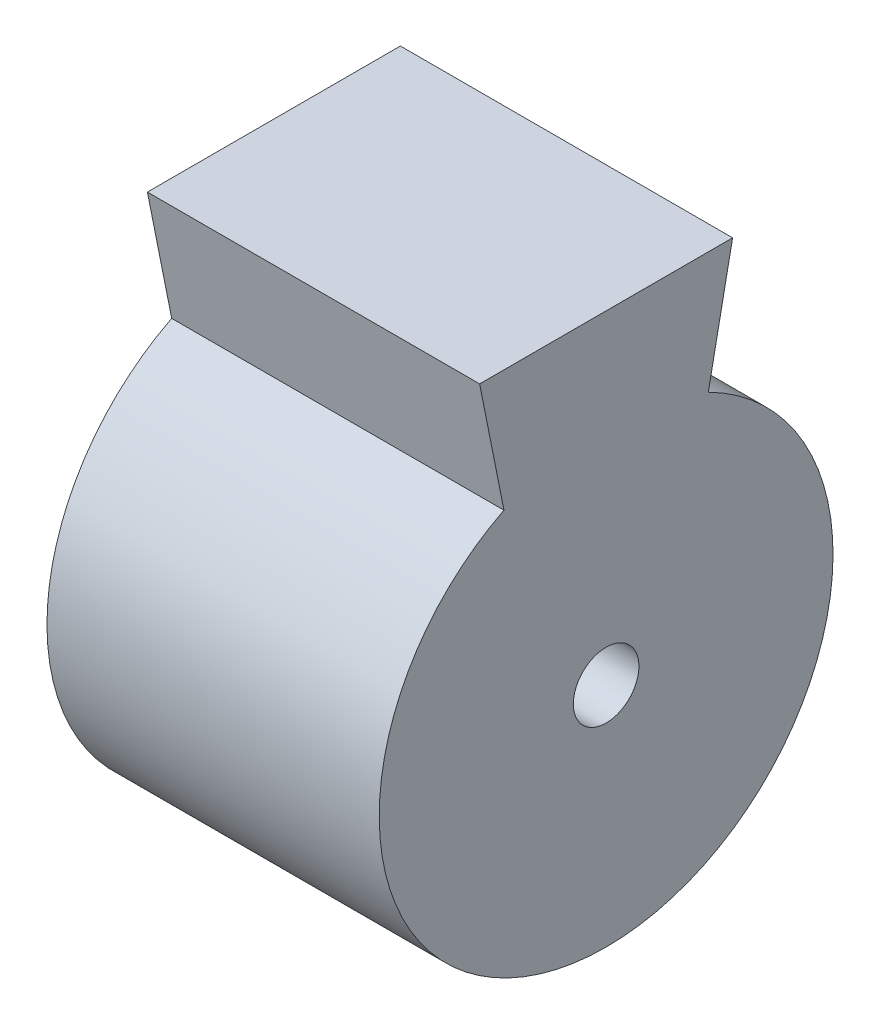
ISO-10303-21;
HEADER;
FILE_DESCRIPTION(('STEP AP214'),'2;1');
FILE_NAME('part.step','',(''),(''),'','','');
FILE_SCHEMA(('AUTOMOTIVE_DESIGN { 1 0 10303 214 1 1 1 1 }'));
ENDSEC;
DATA;
#1=APPLICATION_CONTEXT('core data for automotive mechanical design processes');
#2=APPLICATION_PROTOCOL_DEFINITION('international standard','automotive_design',2000,#1);
#3=PRODUCT_CONTEXT('',#1,'mechanical');
#4=PRODUCT('Part','Part','',(#3));
#5=PRODUCT_RELATED_PRODUCT_CATEGORY('part','',(#4));
#6=PRODUCT_DEFINITION_FORMATION('','',#4);
#7=PRODUCT_DEFINITION_CONTEXT('part definition',#1,'design');
#8=PRODUCT_DEFINITION('design','',#6,#7);
#9=PRODUCT_DEFINITION_SHAPE('','',#8);
#10=(LENGTH_UNIT() NAMED_UNIT(*) SI_UNIT(.MILLI.,.METRE.));
#11=(NAMED_UNIT(*) PLANE_ANGLE_UNIT() SI_UNIT($,.RADIAN.));
#12=(NAMED_UNIT(*) SI_UNIT($,.STERADIAN.) SOLID_ANGLE_UNIT());
#13=UNCERTAINTY_MEASURE_WITH_UNIT(LENGTH_MEASURE(1.E-05),#10,'distance_accuracy_value','');
#14=(GEOMETRIC_REPRESENTATION_CONTEXT(3) GLOBAL_UNCERTAINTY_ASSIGNED_CONTEXT((#13)) GLOBAL_UNIT_ASSIGNED_CONTEXT((#10,
#11,#12)) REPRESENTATION_CONTEXT('',''));
#15=CARTESIAN_POINT('',(0.,0.,0.));
#16=DIRECTION('',(0.,0.,1.));
#17=DIRECTION('',(1.,0.,0.));
#18=AXIS2_PLACEMENT_3D('',#15,#16,#17);
#19=CARTESIAN_POINT('',(41.,0.,0.));
#20=DIRECTION('',(-1.,0.,0.));
#21=DIRECTION('',(0.,0.,1.));
#22=AXIS2_PLACEMENT_3D('',#19,#20,#21);
#23=CYLINDRICAL_SURFACE('',#22,28.);
#24=CARTESIAN_POINT('',(0.,0.,0.));
#25=DIRECTION('',(1.,0.,0.));
#26=DIRECTION('',(0.,0.,-1.));
#27=AXIS2_PLACEMENT_3D('',#24,#25,#26);
#28=CIRCLE('',#27,28.);
#29=CARTESIAN_POINT('',(0.,25.,12.6095202129185));
#30=VERTEX_POINT('',#29);
#31=CARTESIAN_POINT('',(0.,25.,-12.6095202129185));
#32=VERTEX_POINT('',#31);
#33=EDGE_CURVE('E111',#30,#32,#28,.T.);
#34=ORIENTED_EDGE('',*,*,#33,.T.);
#35=DIRECTION('',(-1.,0.,0.));
#36=VECTOR('',#35,1.);
#37=CARTESIAN_POINT('',(41.,25.,-12.6095202129185));
#38=LINE('',#37,#36);
#39=CARTESIAN_POINT('',(41.,25.,-12.6095202129185));
#40=VERTEX_POINT('',#39);
#41=EDGE_CURVE('E11',#40,#32,#38,.T.);
#42=ORIENTED_EDGE('',*,*,#41,.F.);
#43=CARTESIAN_POINT('',(41.,0.,0.));
#44=DIRECTION('',(1.,0.,0.));
#45=DIRECTION('',(0.,0.,-1.));
#46=AXIS2_PLACEMENT_3D('',#43,#44,#45);
#47=CIRCLE('',#46,28.);
#48=CARTESIAN_POINT('',(41.,25.,12.6095202129185));
#49=VERTEX_POINT('',#48);
#50=EDGE_CURVE('E83',#49,#40,#47,.T.);
#51=ORIENTED_EDGE('',*,*,#50,.F.);
#52=DIRECTION('',(-1.,0.,0.));
#53=VECTOR('',#52,1.);
#54=CARTESIAN_POINT('',(41.,25.,12.6095202129185));
#55=LINE('',#54,#53);
#56=EDGE_CURVE('E59',#49,#30,#55,.T.);
#57=ORIENTED_EDGE('',*,*,#56,.T.);
#58=EDGE_LOOP('',(#34,#42,#51,#57));
#59=FACE_BOUND('',#58,.T.);
#60=ADVANCED_FACE('F41',(#59),#23,.T.);
#61=CARTESIAN_POINT('',(41.,-1.46336927171509,-7.31684635857546));
#62=DIRECTION('',(0.,-0.196116135138184,-0.98058067569092));
#63=DIRECTION('',(0.,0.98058067569092,-0.196116135138184));
#64=AXIS2_PLACEMENT_3D('',#61,#62,#63);
#65=PLANE('',#64);
#66=DIRECTION('',(0.,-0.98058067569092,0.196116135138184));
#67=VECTOR('',#66,1.);
#68=CARTESIAN_POINT('',(0.,-1.46336927171509,-7.31684635857546));
#69=LINE('',#68,#67);
#70=CARTESIAN_POINT('',(0.,40.,-15.6095202129185));
#71=VERTEX_POINT('',#70);
#72=EDGE_CURVE('E92',#71,#32,#69,.T.);
#73=ORIENTED_EDGE('',*,*,#72,.F.);
#74=DIRECTION('',(-1.,0.,0.));
#75=VECTOR('',#74,1.);
#76=CARTESIAN_POINT('',(41.,40.,-15.6095202129185));
#77=LINE('',#76,#75);
#78=CARTESIAN_POINT('',(41.,40.,-15.6095202129185));
#79=VERTEX_POINT('',#78);
#80=EDGE_CURVE('E51',#79,#71,#77,.T.);
#81=ORIENTED_EDGE('',*,*,#80,.F.);
#82=DIRECTION('',(0.,-0.98058067569092,0.196116135138184));
#83=VECTOR('',#82,1.);
#84=CARTESIAN_POINT('',(41.,-1.46336927171509,-7.31684635857546));
#85=LINE('',#84,#83);
#86=EDGE_CURVE('E90',#79,#40,#85,.T.);
#87=ORIENTED_EDGE('',*,*,#86,.T.);
#88=ORIENTED_EDGE('',*,*,#41,.T.);
#89=EDGE_LOOP('',(#73,#81,#87,#88));
#90=FACE_BOUND('',#89,.T.);
#91=ADVANCED_FACE('F89',(#90),#65,.T.);
#92=CARTESIAN_POINT('',(41.,40.,0.));
#93=DIRECTION('',(0.,1.,0.));
#94=DIRECTION('',(0.,0.,1.));
#95=AXIS2_PLACEMENT_3D('',#92,#93,#94);
#96=PLANE('',#95);
#97=DIRECTION('',(0.,0.,-1.));
#98=VECTOR('',#97,1.);
#99=CARTESIAN_POINT('',(0.,40.,0.));
#100=LINE('',#99,#98);
#101=CARTESIAN_POINT('',(0.,40.,15.6095202129185));
#102=VERTEX_POINT('',#101);
#103=EDGE_CURVE('E117',#102,#71,#100,.T.);
#104=ORIENTED_EDGE('',*,*,#103,.F.);
#105=DIRECTION('',(-1.,0.,0.));
#106=VECTOR('',#105,1.);
#107=CARTESIAN_POINT('',(41.,40.,15.6095202129185));
#108=LINE('',#107,#106);
#109=CARTESIAN_POINT('',(41.,40.,15.6095202129185));
#110=VERTEX_POINT('',#109);
#111=EDGE_CURVE('E72',#110,#102,#108,.T.);
#112=ORIENTED_EDGE('',*,*,#111,.F.);
#113=DIRECTION('',(0.,0.,-1.));
#114=VECTOR('',#113,1.);
#115=CARTESIAN_POINT('',(41.,40.,0.));
#116=LINE('',#115,#114);
#117=EDGE_CURVE('E100',#110,#79,#116,.T.);
#118=ORIENTED_EDGE('',*,*,#117,.T.);
#119=ORIENTED_EDGE('',*,*,#80,.T.);
#120=EDGE_LOOP('',(#104,#112,#118,#119));
#121=FACE_BOUND('',#120,.T.);
#122=ADVANCED_FACE('F103',(#121),#96,.T.);
#123=CARTESIAN_POINT('',(41.,-1.46336927171509,7.31684635857546));
#124=DIRECTION('',(0.,-0.196116135138184,0.98058067569092));
#125=DIRECTION('',(0.,-0.98058067569092,-0.196116135138184));
#126=AXIS2_PLACEMENT_3D('',#123,#124,#125);
#127=PLANE('',#126);
#128=DIRECTION('',(0.,0.98058067569092,0.196116135138184));
#129=VECTOR('',#128,1.);
#130=CARTESIAN_POINT('',(0.,-1.46336927171509,7.31684635857546));
#131=LINE('',#130,#129);
#132=EDGE_CURVE('E120',#30,#102,#131,.T.);
#133=ORIENTED_EDGE('',*,*,#132,.F.);
#134=ORIENTED_EDGE('',*,*,#56,.F.);
#135=DIRECTION('',(0.,0.98058067569092,0.196116135138184));
#136=VECTOR('',#135,1.);
#137=CARTESIAN_POINT('',(41.,-1.46336927171509,7.31684635857546));
#138=LINE('',#137,#136);
#139=EDGE_CURVE('E105',#49,#110,#138,.T.);
#140=ORIENTED_EDGE('',*,*,#139,.T.);
#141=ORIENTED_EDGE('',*,*,#111,.T.);
#142=EDGE_LOOP('',(#133,#134,#140,#141));
#143=FACE_BOUND('',#142,.T.);
#144=ADVANCED_FACE('F163',(#143),#127,.T.);
#145=CARTESIAN_POINT('',(41.,0.,0.));
#146=DIRECTION('',(1.,0.,0.));
#147=DIRECTION('',(0.,0.,-1.));
#148=AXIS2_PLACEMENT_3D('',#145,#146,#147);
#149=PLANE('',#148);
#150=CARTESIAN_POINT('',(41.,0.,0.));
#151=DIRECTION('',(1.,0.,0.));
#152=DIRECTION('',(0.,0.,-1.));
#153=AXIS2_PLACEMENT_3D('',#150,#151,#152);
#154=CIRCLE('',#153,4.05);
#155=CARTESIAN_POINT('',(41.,0.,-4.05));
#156=VERTEX_POINT('',#155);
#157=EDGE_CURVE('E137',#156,#156,#154,.T.);
#158=ORIENTED_EDGE('',*,*,#157,.F.);
#159=EDGE_LOOP('',(#158));
#160=FACE_BOUND('',#159,.T.);
#161=ORIENTED_EDGE('',*,*,#50,.T.);
#162=ORIENTED_EDGE('',*,*,#86,.F.);
#163=ORIENTED_EDGE('',*,*,#117,.F.);
#164=ORIENTED_EDGE('',*,*,#139,.F.);
#165=EDGE_LOOP('',(#161,#162,#163,#164));
#166=FACE_BOUND('',#165,.T.);
#167=ADVANCED_FACE('F99',(#160,#166),#149,.T.);
#168=CARTESIAN_POINT('',(0.,0.,0.));
#169=DIRECTION('',(1.,0.,0.));
#170=DIRECTION('',(0.,0.,-1.));
#171=AXIS2_PLACEMENT_3D('',#168,#169,#170);
#172=PLANE('',#171);
#173=CARTESIAN_POINT('',(0.,0.,0.));
#174=DIRECTION('',(1.,0.,0.));
#175=DIRECTION('',(0.,0.,-1.));
#176=AXIS2_PLACEMENT_3D('',#173,#174,#175);
#177=CIRCLE('',#176,10.05);
#178=CARTESIAN_POINT('',(0.,0.,-10.05));
#179=VERTEX_POINT('',#178);
#180=EDGE_CURVE('E130',#179,#179,#177,.T.);
#181=ORIENTED_EDGE('',*,*,#180,.T.);
#182=EDGE_LOOP('',(#181));
#183=FACE_BOUND('',#182,.T.);
#184=ORIENTED_EDGE('',*,*,#33,.F.);
#185=ORIENTED_EDGE('',*,*,#132,.T.);
#186=ORIENTED_EDGE('',*,*,#103,.T.);
#187=ORIENTED_EDGE('',*,*,#72,.T.);
#188=EDGE_LOOP('',(#184,#185,#186,#187));
#189=FACE_BOUND('',#188,.T.);
#190=ADVANCED_FACE('F157',(#183,#189),#172,.F.);
#191=CARTESIAN_POINT('',(8.1,0.,0.));
#192=DIRECTION('',(-1.,0.,0.));
#193=DIRECTION('',(0.,0.,1.));
#194=AXIS2_PLACEMENT_3D('',#191,#192,#193);
#195=CYLINDRICAL_SURFACE('',#194,10.05);
#196=CARTESIAN_POINT('',(8.1,0.,0.));
#197=DIRECTION('',(1.,0.,0.));
#198=DIRECTION('',(0.,0.,-1.));
#199=AXIS2_PLACEMENT_3D('',#196,#197,#198);
#200=CIRCLE('',#199,10.05);
#201=CARTESIAN_POINT('',(8.1,0.,-10.05));
#202=VERTEX_POINT('',#201);
#203=EDGE_CURVE('E114',#202,#202,#200,.T.);
#204=ORIENTED_EDGE('',*,*,#203,.T.);
#205=EDGE_LOOP('',(#204));
#206=FACE_BOUND('',#205,.T.);
#207=ORIENTED_EDGE('',*,*,#180,.F.);
#208=EDGE_LOOP('',(#207));
#209=FACE_BOUND('',#208,.T.);
#210=ADVANCED_FACE('F151',(#206,#209),#195,.F.);
#211=CARTESIAN_POINT('',(8.1,0.,0.));
#212=DIRECTION('',(1.,0.,0.));
#213=DIRECTION('',(0.,0.,-1.));
#214=AXIS2_PLACEMENT_3D('',#211,#212,#213);
#215=PLANE('',#214);
#216=CARTESIAN_POINT('',(8.1,0.,0.));
#217=DIRECTION('',(1.,0.,0.));
#218=DIRECTION('',(0.,0.,-1.));
#219=AXIS2_PLACEMENT_3D('',#216,#217,#218);
#220=CIRCLE('',#219,4.05);
#221=CARTESIAN_POINT('',(8.1,0.,-4.05));
#222=VERTEX_POINT('',#221);
#223=EDGE_CURVE('E44',#222,#222,#220,.F.);
#224=ORIENTED_EDGE('',*,*,#223,.F.);
#225=EDGE_LOOP('',(#224));
#226=FACE_BOUND('',#225,.T.);
#227=ORIENTED_EDGE('',*,*,#203,.F.);
#228=EDGE_LOOP('',(#227));
#229=FACE_BOUND('',#228,.T.);
#230=ADVANCED_FACE('F148',(#226,#229),#215,.F.);
#231=CARTESIAN_POINT('',(41.,0.,0.));
#232=DIRECTION('',(-1.,0.,0.));
#233=DIRECTION('',(0.,0.,1.));
#234=AXIS2_PLACEMENT_3D('',#231,#232,#233);
#235=CYLINDRICAL_SURFACE('',#234,4.05);
#236=ORIENTED_EDGE('',*,*,#157,.T.);
#237=EDGE_LOOP('',(#236));
#238=FACE_BOUND('',#237,.T.);
#239=ORIENTED_EDGE('',*,*,#223,.T.);
#240=EDGE_LOOP('',(#239));
#241=FACE_BOUND('',#240,.T.);
#242=ADVANCED_FACE('F146',(#238,#241),#235,.F.);
#243=CLOSED_SHELL('',(#60,#91,#122,#144,#167,#190,#210,#230,#242));
#244=MANIFOLD_SOLID_BREP('B2',#243);
#245=ADVANCED_BREP_SHAPE_REPRESENTATION('',(#18,#244),#14);
#246=SHAPE_DEFINITION_REPRESENTATION(#9,#245);
ENDSEC;
END-ISO-10303-21;
